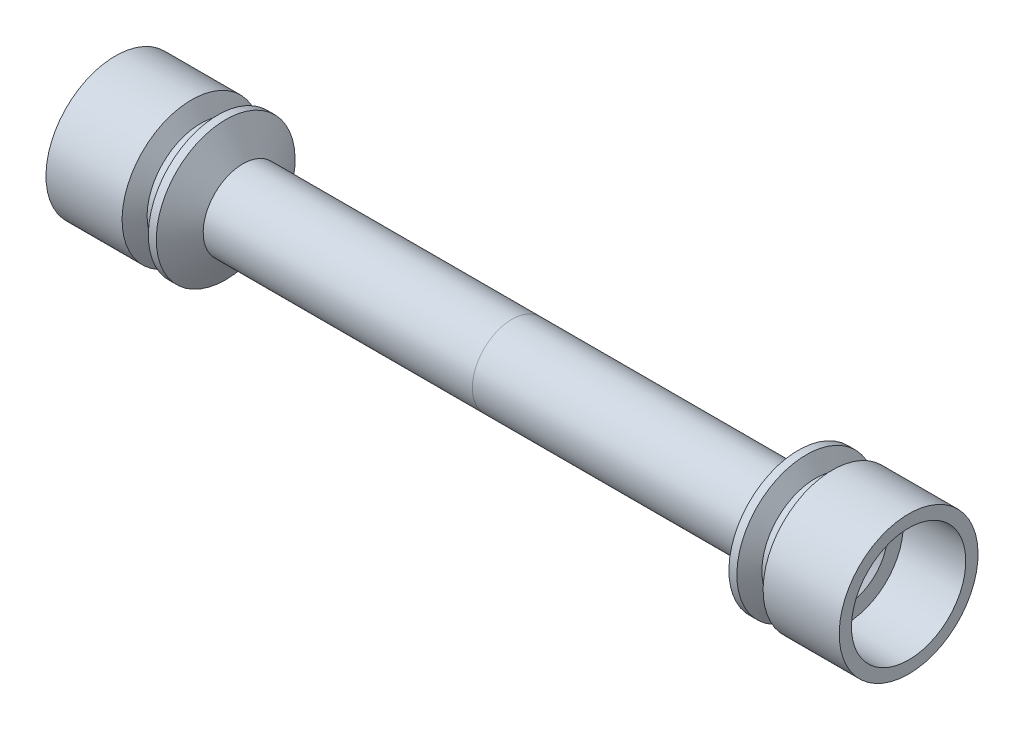
ISO-10303-21;
HEADER;
FILE_DESCRIPTION(('STEP AP214'),'2;1');
FILE_NAME('part.step','',(''),(''),'','','');
FILE_SCHEMA(('AUTOMOTIVE_DESIGN { 1 0 10303 214 1 1 1 1 }'));
ENDSEC;
DATA;
#1=APPLICATION_CONTEXT('core data for automotive mechanical design processes');
#2=APPLICATION_PROTOCOL_DEFINITION('international standard','automotive_design',2000,#1);
#3=PRODUCT_CONTEXT('',#1,'mechanical');
#4=PRODUCT('Part','Part','',(#3));
#5=PRODUCT_RELATED_PRODUCT_CATEGORY('part','',(#4));
#6=PRODUCT_DEFINITION_FORMATION('','',#4);
#7=PRODUCT_DEFINITION_CONTEXT('part definition',#1,'design');
#8=PRODUCT_DEFINITION('design','',#6,#7);
#9=PRODUCT_DEFINITION_SHAPE('','',#8);
#10=(LENGTH_UNIT() NAMED_UNIT(*) SI_UNIT(.MILLI.,.METRE.));
#11=(NAMED_UNIT(*) PLANE_ANGLE_UNIT() SI_UNIT($,.RADIAN.));
#12=(NAMED_UNIT(*) SI_UNIT($,.STERADIAN.) SOLID_ANGLE_UNIT());
#13=UNCERTAINTY_MEASURE_WITH_UNIT(LENGTH_MEASURE(1.E-05),#10,'distance_accuracy_value','');
#14=(GEOMETRIC_REPRESENTATION_CONTEXT(3) GLOBAL_UNCERTAINTY_ASSIGNED_CONTEXT((#13)) GLOBAL_UNIT_ASSIGNED_CONTEXT((#10,
#11,#12)) REPRESENTATION_CONTEXT('',''));
#15=CARTESIAN_POINT('',(0.,0.,0.));
#16=DIRECTION('',(0.,0.,1.));
#17=DIRECTION('',(1.,0.,0.));
#18=AXIS2_PLACEMENT_3D('',#15,#16,#17);
#19=CARTESIAN_POINT('',(22.9205151581292,0.,0.));
#20=DIRECTION('',(1.,0.,0.));
#21=DIRECTION('',(0.,-1.,0.));
#22=AXIS2_PLACEMENT_3D('',#19,#20,#21);
#23=CONICAL_SURFACE('',#22,5.55625,1.0471975511966);
#24=CARTESIAN_POINT('',(21.5456998296214,0.,0.));
#25=DIRECTION('',(-1.,0.,0.));
#26=DIRECTION('',(0.,-1.,0.));
#27=AXIS2_PLACEMENT_3D('',#24,#25,#26);
#28=CIRCLE('',#27,3.175);
#29=CARTESIAN_POINT('',(21.5456998296214,-3.175,0.));
#30=VERTEX_POINT('',#29);
#31=EDGE_CURVE('E177',#30,#30,#28,.T.);
#32=ORIENTED_EDGE('',*,*,#31,.F.);
#33=EDGE_LOOP('',(#32));
#34=FACE_BOUND('',#33,.T.);
#35=CARTESIAN_POINT('',(22.9205151581292,0.,0.));
#36=DIRECTION('',(-1.,0.,0.));
#37=DIRECTION('',(0.,-1.,0.));
#38=AXIS2_PLACEMENT_3D('',#35,#36,#37);
#39=CIRCLE('',#38,5.55625);
#40=CARTESIAN_POINT('',(22.9205151581292,-5.55625,0.));
#41=VERTEX_POINT('',#40);
#42=EDGE_CURVE('E12',#41,#41,#39,.T.);
#43=ORIENTED_EDGE('',*,*,#42,.T.);
#44=EDGE_LOOP('',(#43));
#45=FACE_BOUND('',#44,.T.);
#46=ADVANCED_FACE('F59',(#34,#45),#23,.T.);
#47=CARTESIAN_POINT('',(31.75,0.,0.));
#48=DIRECTION('',(1.,0.,0.));
#49=DIRECTION('',(0.,-1.,0.));
#50=AXIS2_PLACEMENT_3D('',#47,#48,#49);
#51=CYLINDRICAL_SURFACE('',#50,5.55625);
#52=ORIENTED_EDGE('',*,*,#42,.F.);
#53=EDGE_LOOP('',(#52));
#54=FACE_BOUND('',#53,.T.);
#55=CARTESIAN_POINT('',(23.5555151581292,0.,0.));
#56=DIRECTION('',(-1.,0.,0.));
#57=DIRECTION('',(0.,-1.,0.));
#58=AXIS2_PLACEMENT_3D('',#55,#56,#57);
#59=CIRCLE('',#58,5.55625);
#60=CARTESIAN_POINT('',(23.5555151581292,-5.55625,0.));
#61=VERTEX_POINT('',#60);
#62=EDGE_CURVE('E66',#61,#61,#59,.T.);
#63=ORIENTED_EDGE('',*,*,#62,.T.);
#64=EDGE_LOOP('',(#63));
#65=FACE_BOUND('',#64,.T.);
#66=ADVANCED_FACE('F131',(#54,#65),#51,.T.);
#67=CARTESIAN_POINT('',(24.28875,0.,0.));
#68=DIRECTION('',(-1.,0.,0.));
#69=DIRECTION('',(0.,1.,0.));
#70=AXIS2_PLACEMENT_3D('',#67,#68,#69);
#71=CONICAL_SURFACE('',#70,4.28625,1.0471975511966);
#72=ORIENTED_EDGE('',*,*,#62,.F.);
#73=EDGE_LOOP('',(#72));
#74=FACE_BOUND('',#73,.T.);
#75=CARTESIAN_POINT('',(24.28875,0.,0.));
#76=DIRECTION('',(-1.,0.,0.));
#77=DIRECTION('',(0.,-1.,0.));
#78=AXIS2_PLACEMENT_3D('',#75,#76,#77);
#79=CIRCLE('',#78,4.28625);
#80=CARTESIAN_POINT('',(24.28875,-4.28625,0.));
#81=VERTEX_POINT('',#80);
#82=EDGE_CURVE('E124',#81,#81,#79,.T.);
#83=ORIENTED_EDGE('',*,*,#82,.T.);
#84=EDGE_LOOP('',(#83));
#85=FACE_BOUND('',#84,.T.);
#86=ADVANCED_FACE('F133',(#74,#85),#71,.T.);
#87=CARTESIAN_POINT('',(31.75,0.,0.));
#88=DIRECTION('',(1.,0.,0.));
#89=DIRECTION('',(0.,-1.,0.));
#90=AXIS2_PLACEMENT_3D('',#87,#88,#89);
#91=CYLINDRICAL_SURFACE('',#90,4.28625);
#92=ORIENTED_EDGE('',*,*,#82,.F.);
#93=EDGE_LOOP('',(#92));
#94=FACE_BOUND('',#93,.T.);
#95=CARTESIAN_POINT('',(24.92375,0.,0.));
#96=DIRECTION('',(-1.,0.,0.));
#97=DIRECTION('',(0.,-1.,0.));
#98=AXIS2_PLACEMENT_3D('',#95,#96,#97);
#99=CIRCLE('',#98,4.28625);
#100=CARTESIAN_POINT('',(24.92375,-4.28625,0.));
#101=VERTEX_POINT('',#100);
#102=EDGE_CURVE('E120',#101,#101,#99,.T.);
#103=ORIENTED_EDGE('',*,*,#102,.T.);
#104=EDGE_LOOP('',(#103));
#105=FACE_BOUND('',#104,.T.);
#106=ADVANCED_FACE('F136',(#94,#105),#91,.T.);
#107=CARTESIAN_POINT('',(25.6569848418708,0.,0.));
#108=DIRECTION('',(1.,0.,0.));
#109=DIRECTION('',(0.,-1.,0.));
#110=AXIS2_PLACEMENT_3D('',#107,#108,#109);
#111=CONICAL_SURFACE('',#110,5.55625,1.0471975511966);
#112=ORIENTED_EDGE('',*,*,#102,.F.);
#113=EDGE_LOOP('',(#112));
#114=FACE_BOUND('',#113,.T.);
#115=CARTESIAN_POINT('',(25.6569848418708,0.,0.));
#116=DIRECTION('',(-1.,0.,0.));
#117=DIRECTION('',(0.,-1.,0.));
#118=AXIS2_PLACEMENT_3D('',#115,#116,#117);
#119=CIRCLE('',#118,5.55625);
#120=CARTESIAN_POINT('',(25.6569848418708,-5.55625,0.));
#121=VERTEX_POINT('',#120);
#122=EDGE_CURVE('E116',#121,#121,#119,.T.);
#123=ORIENTED_EDGE('',*,*,#122,.T.);
#124=EDGE_LOOP('',(#123));
#125=FACE_BOUND('',#124,.T.);
#126=ADVANCED_FACE('F142',(#114,#125),#111,.T.);
#127=CARTESIAN_POINT('',(31.75,0.,0.));
#128=DIRECTION('',(1.,0.,0.));
#129=DIRECTION('',(0.,-1.,0.));
#130=AXIS2_PLACEMENT_3D('',#127,#128,#129);
#131=CYLINDRICAL_SURFACE('',#130,5.55625);
#132=ORIENTED_EDGE('',*,*,#122,.F.);
#133=EDGE_LOOP('',(#132));
#134=FACE_BOUND('',#133,.T.);
#135=CARTESIAN_POINT('',(31.75,0.,0.));
#136=DIRECTION('',(-1.,0.,0.));
#137=DIRECTION('',(0.,-1.,0.));
#138=AXIS2_PLACEMENT_3D('',#135,#136,#137);
#139=CIRCLE('',#138,5.55625);
#140=CARTESIAN_POINT('',(31.75,-5.55625,0.));
#141=VERTEX_POINT('',#140);
#142=EDGE_CURVE('E112',#141,#141,#139,.T.);
#143=ORIENTED_EDGE('',*,*,#142,.T.);
#144=EDGE_LOOP('',(#143));
#145=FACE_BOUND('',#144,.T.);
#146=ADVANCED_FACE('F148',(#134,#145),#131,.T.);
#147=CARTESIAN_POINT('',(31.75,0.,0.));
#148=DIRECTION('',(-1.,0.,0.));
#149=DIRECTION('',(0.,1.,0.));
#150=AXIS2_PLACEMENT_3D('',#147,#148,#149);
#151=PLANE('',#150);
#152=CARTESIAN_POINT('',(31.75,0.,0.));
#153=DIRECTION('',(-1.,0.,0.));
#154=DIRECTION('',(0.,-1.,0.));
#155=AXIS2_PLACEMENT_3D('',#152,#153,#154);
#156=CIRCLE('',#155,4.575);
#157=CARTESIAN_POINT('',(31.75,-4.575,0.));
#158=VERTEX_POINT('',#157);
#159=EDGE_CURVE('E108',#158,#158,#156,.T.);
#160=ORIENTED_EDGE('',*,*,#159,.T.);
#161=EDGE_LOOP('',(#160));
#162=FACE_BOUND('',#161,.T.);
#163=ORIENTED_EDGE('',*,*,#142,.F.);
#164=EDGE_LOOP('',(#163));
#165=FACE_BOUND('',#164,.T.);
#166=ADVANCED_FACE('F154',(#162,#165),#151,.F.);
#167=CARTESIAN_POINT('',(31.75,0.,0.));
#168=DIRECTION('',(1.,0.,0.));
#169=DIRECTION('',(0.,-1.,0.));
#170=AXIS2_PLACEMENT_3D('',#167,#168,#169);
#171=CYLINDRICAL_SURFACE('',#170,4.575);
#172=CARTESIAN_POINT('',(26.75,0.,0.));
#173=DIRECTION('',(-1.,0.,0.));
#174=DIRECTION('',(0.,-1.,0.));
#175=AXIS2_PLACEMENT_3D('',#172,#173,#174);
#176=CIRCLE('',#175,4.575);
#177=CARTESIAN_POINT('',(26.75,-4.575,0.));
#178=VERTEX_POINT('',#177);
#179=EDGE_CURVE('E104',#178,#178,#176,.T.);
#180=ORIENTED_EDGE('',*,*,#179,.T.);
#181=EDGE_LOOP('',(#180));
#182=FACE_BOUND('',#181,.T.);
#183=ORIENTED_EDGE('',*,*,#159,.F.);
#184=EDGE_LOOP('',(#183));
#185=FACE_BOUND('',#184,.T.);
#186=ADVANCED_FACE('F159',(#182,#185),#171,.F.);
#187=CARTESIAN_POINT('',(26.75,0.,0.));
#188=DIRECTION('',(-1.,0.,0.));
#189=DIRECTION('',(0.,1.,0.));
#190=AXIS2_PLACEMENT_3D('',#187,#188,#189);
#191=PLANE('',#190);
#192=CARTESIAN_POINT('',(26.75,0.,0.));
#193=DIRECTION('',(-1.,0.,0.));
#194=DIRECTION('',(0.,-1.,0.));
#195=AXIS2_PLACEMENT_3D('',#192,#193,#194);
#196=CIRCLE('',#195,3.30500000000001);
#197=CARTESIAN_POINT('',(26.75,-3.30500000000001,0.));
#198=VERTEX_POINT('',#197);
#199=EDGE_CURVE('E100',#198,#198,#196,.T.);
#200=ORIENTED_EDGE('',*,*,#199,.T.);
#201=EDGE_LOOP('',(#200));
#202=FACE_BOUND('',#201,.T.);
#203=ORIENTED_EDGE('',*,*,#179,.F.);
#204=EDGE_LOOP('',(#203));
#205=FACE_BOUND('',#204,.T.);
#206=ADVANCED_FACE('F165',(#202,#205),#191,.F.);
#207=CARTESIAN_POINT('',(26.75,0.,0.));
#208=DIRECTION('',(1.,0.,0.));
#209=DIRECTION('',(0.,-1.,0.));
#210=AXIS2_PLACEMENT_3D('',#207,#208,#209);
#211=CONICAL_SURFACE('',#210,3.30500000000001,0.785398163397453);
#212=CARTESIAN_POINT('',(26.242,0.,0.));
#213=DIRECTION('',(-1.,0.,0.));
#214=DIRECTION('',(0.,-1.,0.));
#215=AXIS2_PLACEMENT_3D('',#212,#213,#214);
#216=CIRCLE('',#215,2.797);
#217=CARTESIAN_POINT('',(26.242,-2.797,0.));
#218=VERTEX_POINT('',#217);
#219=EDGE_CURVE('E96',#218,#218,#216,.T.);
#220=ORIENTED_EDGE('',*,*,#219,.T.);
#221=EDGE_LOOP('',(#220));
#222=FACE_BOUND('',#221,.T.);
#223=ORIENTED_EDGE('',*,*,#199,.F.);
#224=EDGE_LOOP('',(#223));
#225=FACE_BOUND('',#224,.T.);
#226=ADVANCED_FACE('F209',(#222,#225),#211,.F.);
#227=CARTESIAN_POINT('',(26.242,0.,0.));
#228=DIRECTION('',(-1.,0.,0.));
#229=DIRECTION('',(0.,1.,0.));
#230=AXIS2_PLACEMENT_3D('',#227,#228,#229);
#231=PLANE('',#230);
#232=CARTESIAN_POINT('',(26.242,0.,0.));
#233=DIRECTION('',(-1.,0.,0.));
#234=DIRECTION('',(0.,-1.,0.));
#235=AXIS2_PLACEMENT_3D('',#232,#233,#234);
#236=CIRCLE('',#235,1.7145);
#237=CARTESIAN_POINT('',(26.242,-1.7145,0.));
#238=VERTEX_POINT('',#237);
#239=EDGE_CURVE('E86',#238,#238,#236,.T.);
#240=ORIENTED_EDGE('',*,*,#239,.T.);
#241=EDGE_LOOP('',(#240));
#242=FACE_BOUND('',#241,.T.);
#243=ORIENTED_EDGE('',*,*,#219,.F.);
#244=EDGE_LOOP('',(#243));
#245=FACE_BOUND('',#244,.T.);
#246=ADVANCED_FACE('F205',(#242,#245),#231,.F.);
#247=CARTESIAN_POINT('',(31.75,0.,0.));
#248=DIRECTION('',(1.,0.,0.));
#249=DIRECTION('',(0.,-1.,0.));
#250=AXIS2_PLACEMENT_3D('',#247,#248,#249);
#251=CYLINDRICAL_SURFACE('',#250,1.7145);
#252=CARTESIAN_POINT('',(21.925,0.,0.));
#253=DIRECTION('',(-1.,0.,0.));
#254=DIRECTION('',(0.,-1.,0.));
#255=AXIS2_PLACEMENT_3D('',#252,#253,#254);
#256=CIRCLE('',#255,1.7145);
#257=CARTESIAN_POINT('',(21.925,-1.7145,0.));
#258=VERTEX_POINT('',#257);
#259=EDGE_CURVE('E80',#258,#258,#256,.T.);
#260=ORIENTED_EDGE('',*,*,#259,.T.);
#261=EDGE_LOOP('',(#260));
#262=FACE_BOUND('',#261,.T.);
#263=ORIENTED_EDGE('',*,*,#239,.F.);
#264=EDGE_LOOP('',(#263));
#265=FACE_BOUND('',#264,.T.);
#266=ADVANCED_FACE('F201',(#262,#265),#251,.F.);
#267=CARTESIAN_POINT('',(21.925,0.,0.));
#268=DIRECTION('',(-1.,0.,0.));
#269=DIRECTION('',(0.,1.,0.));
#270=AXIS2_PLACEMENT_3D('',#267,#268,#269);
#271=PLANE('',#270);
#272=ORIENTED_EDGE('',*,*,#259,.F.);
#273=EDGE_LOOP('',(#272));
#274=FACE_BOUND('',#273,.T.);
#275=ADVANCED_FACE('F73',(#274),#271,.F.);
#276=CARTESIAN_POINT('',(12.5,0.,0.));
#277=DIRECTION('',(-1.,0.,0.));
#278=DIRECTION('',(0.,1.,0.));
#279=AXIS2_PLACEMENT_3D('',#276,#277,#278);
#280=CONICAL_SURFACE('',#279,1.6,0.78539816339745);
#281=CARTESIAN_POINT('',(14.1,0.,0.));
#282=VERTEX_POINT('',#281);
#283=VERTEX_LOOP('',#282);
#284=FACE_BOUND('',#283,.T.);
#285=CARTESIAN_POINT('',(12.5,0.,0.));
#286=DIRECTION('',(-1.,0.,0.));
#287=DIRECTION('',(0.,-1.,0.));
#288=AXIS2_PLACEMENT_3D('',#285,#286,#287);
#289=CIRCLE('',#288,1.6);
#290=CARTESIAN_POINT('',(12.5,-1.6,0.));
#291=VERTEX_POINT('',#290);
#292=EDGE_CURVE('E77',#291,#291,#289,.T.);
#293=ORIENTED_EDGE('',*,*,#292,.T.);
#294=EDGE_LOOP('',(#293));
#295=FACE_BOUND('',#294,.T.);
#296=ADVANCED_FACE('F69',(#284,#295),#280,.F.);
#297=CARTESIAN_POINT('',(31.75,0.,0.));
#298=DIRECTION('',(1.,0.,0.));
#299=DIRECTION('',(0.,-1.,0.));
#300=AXIS2_PLACEMENT_3D('',#297,#298,#299);
#301=CYLINDRICAL_SURFACE('',#300,1.6);
#302=ORIENTED_EDGE('',*,*,#292,.F.);
#303=EDGE_LOOP('',(#302));
#304=FACE_BOUND('',#303,.T.);
#305=CARTESIAN_POINT('',(0.,0.,0.));
#306=DIRECTION('',(-1.,0.,0.));
#307=DIRECTION('',(0.,-1.,0.));
#308=AXIS2_PLACEMENT_3D('',#305,#306,#307);
#309=CIRCLE('',#308,1.6);
#310=CARTESIAN_POINT('',(0.,-1.6,0.));
#311=VERTEX_POINT('',#310);
#312=EDGE_CURVE('E81',#311,#311,#309,.T.);
#313=ORIENTED_EDGE('',*,*,#312,.T.);
#314=EDGE_LOOP('',(#313));
#315=FACE_BOUND('',#314,.T.);
#316=ADVANCED_FACE('F72',(#304,#315),#301,.F.);
#317=CARTESIAN_POINT('',(0.,0.,0.));
#318=DIRECTION('',(1.,0.,0.));
#319=DIRECTION('',(0.,-1.,0.));
#320=AXIS2_PLACEMENT_3D('',#317,#318,#319);
#321=PLANE('',#320);
#322=CARTESIAN_POINT('',(0.,0.,0.));
#323=DIRECTION('',(-1.,0.,0.));
#324=DIRECTION('',(0.,-1.,0.));
#325=AXIS2_PLACEMENT_3D('',#322,#323,#324);
#326=CIRCLE('',#325,3.175);
#327=CARTESIAN_POINT('',(0.,-3.175,0.));
#328=VERTEX_POINT('',#327);
#329=EDGE_CURVE('E89',#328,#328,#326,.T.);
#330=ORIENTED_EDGE('',*,*,#329,.T.);
#331=EDGE_LOOP('',(#330));
#332=FACE_BOUND('',#331,.T.);
#333=ORIENTED_EDGE('',*,*,#312,.F.);
#334=EDGE_LOOP('',(#333));
#335=FACE_BOUND('',#334,.T.);
#336=ADVANCED_FACE('F186',(#332,#335),#321,.F.);
#337=CARTESIAN_POINT('',(31.75,0.,0.));
#338=DIRECTION('',(1.,0.,0.));
#339=DIRECTION('',(0.,-1.,0.));
#340=AXIS2_PLACEMENT_3D('',#337,#338,#339);
#341=CYLINDRICAL_SURFACE('',#340,3.175);
#342=ORIENTED_EDGE('',*,*,#329,.F.);
#343=EDGE_LOOP('',(#342));
#344=FACE_BOUND('',#343,.T.);
#345=ORIENTED_EDGE('',*,*,#31,.T.);
#346=EDGE_LOOP('',(#345));
#347=FACE_BOUND('',#346,.T.);
#348=ADVANCED_FACE('F189',(#344,#347),#341,.T.);
#349=CLOSED_SHELL('',(#46,#66,#86,#106,#126,#146,#166,#186,#206,#226,#246,#266,#275,#296,#316,
#336,#348));
#350=MANIFOLD_SOLID_BREP('B2',#349);
#351=CARTESIAN_POINT('',(-22.9205151581292,0.,0.));
#352=DIRECTION('',(-1.,0.,0.));
#353=DIRECTION('',(0.,-1.,0.));
#354=AXIS2_PLACEMENT_3D('',#351,#352,#353);
#355=CONICAL_SURFACE('',#354,5.55625,1.0471975511966);
#356=CARTESIAN_POINT('',(-21.5456998296214,0.,0.));
#357=DIRECTION('',(-1.,0.,0.));
#358=DIRECTION('',(0.,-1.,0.));
#359=AXIS2_PLACEMENT_3D('',#356,#357,#358);
#360=CIRCLE('',#359,3.175);
#361=CARTESIAN_POINT('',(-21.5456998296214,-3.175,0.));
#362=VERTEX_POINT('',#361);
#363=EDGE_CURVE('E467',#362,#362,#360,.T.);
#364=ORIENTED_EDGE('',*,*,#363,.T.);
#365=EDGE_LOOP('',(#364));
#366=FACE_BOUND('',#365,.T.);
#367=CARTESIAN_POINT('',(-22.9205151581292,0.,0.));
#368=DIRECTION('',(-1.,0.,0.));
#369=DIRECTION('',(0.,-1.,0.));
#370=AXIS2_PLACEMENT_3D('',#367,#368,#369);
#371=CIRCLE('',#370,5.55625);
#372=CARTESIAN_POINT('',(-22.9205151581292,-5.55625,0.));
#373=VERTEX_POINT('',#372);
#374=EDGE_CURVE('E386',#373,#373,#371,.T.);
#375=ORIENTED_EDGE('',*,*,#374,.F.);
#376=EDGE_LOOP('',(#375));
#377=FACE_BOUND('',#376,.T.);
#378=ADVANCED_FACE('F328',(#366,#377),#355,.T.);
#379=CARTESIAN_POINT('',(-31.75,0.,0.));
#380=DIRECTION('',(-1.,0.,0.));
#381=DIRECTION('',(0.,-1.,0.));
#382=AXIS2_PLACEMENT_3D('',#379,#380,#381);
#383=CYLINDRICAL_SURFACE('',#382,5.55625);
#384=ORIENTED_EDGE('',*,*,#374,.T.);
#385=EDGE_LOOP('',(#384));
#386=FACE_BOUND('',#385,.T.);
#387=CARTESIAN_POINT('',(-23.5555151581292,0.,0.));
#388=DIRECTION('',(-1.,0.,0.));
#389=DIRECTION('',(0.,-1.,0.));
#390=AXIS2_PLACEMENT_3D('',#387,#388,#389);
#391=CIRCLE('',#390,5.55625);
#392=CARTESIAN_POINT('',(-23.5555151581292,-5.55625,0.));
#393=VERTEX_POINT('',#392);
#394=EDGE_CURVE('E383',#393,#393,#391,.T.);
#395=ORIENTED_EDGE('',*,*,#394,.F.);
#396=EDGE_LOOP('',(#395));
#397=FACE_BOUND('',#396,.T.);
#398=ADVANCED_FACE('F406',(#386,#397),#383,.T.);
#399=CARTESIAN_POINT('',(-24.28875,0.,0.));
#400=DIRECTION('',(1.,0.,0.));
#401=DIRECTION('',(0.,1.,0.));
#402=AXIS2_PLACEMENT_3D('',#399,#400,#401);
#403=CONICAL_SURFACE('',#402,4.28625,1.0471975511966);
#404=ORIENTED_EDGE('',*,*,#394,.T.);
#405=EDGE_LOOP('',(#404));
#406=FACE_BOUND('',#405,.T.);
#407=CARTESIAN_POINT('',(-24.28875,0.,0.));
#408=DIRECTION('',(-1.,0.,0.));
#409=DIRECTION('',(0.,-1.,0.));
#410=AXIS2_PLACEMENT_3D('',#407,#408,#409);
#411=CIRCLE('',#410,4.28625);
#412=CARTESIAN_POINT('',(-24.28875,-4.28625,0.));
#413=VERTEX_POINT('',#412);
#414=EDGE_CURVE('E380',#413,#413,#411,.T.);
#415=ORIENTED_EDGE('',*,*,#414,.F.);
#416=EDGE_LOOP('',(#415));
#417=FACE_BOUND('',#416,.T.);
#418=ADVANCED_FACE('F411',(#406,#417),#403,.T.);
#419=CARTESIAN_POINT('',(-31.75,0.,0.));
#420=DIRECTION('',(-1.,0.,0.));
#421=DIRECTION('',(0.,-1.,0.));
#422=AXIS2_PLACEMENT_3D('',#419,#420,#421);
#423=CYLINDRICAL_SURFACE('',#422,4.28625);
#424=ORIENTED_EDGE('',*,*,#414,.T.);
#425=EDGE_LOOP('',(#424));
#426=FACE_BOUND('',#425,.T.);
#427=CARTESIAN_POINT('',(-24.92375,0.,0.));
#428=DIRECTION('',(-1.,0.,0.));
#429=DIRECTION('',(0.,-1.,0.));
#430=AXIS2_PLACEMENT_3D('',#427,#428,#429);
#431=CIRCLE('',#430,4.28625);
#432=CARTESIAN_POINT('',(-24.92375,-4.28625,0.));
#433=VERTEX_POINT('',#432);
#434=EDGE_CURVE('E377',#433,#433,#431,.T.);
#435=ORIENTED_EDGE('',*,*,#434,.F.);
#436=EDGE_LOOP('',(#435));
#437=FACE_BOUND('',#436,.T.);
#438=ADVANCED_FACE('F419',(#426,#437),#423,.T.);
#439=CARTESIAN_POINT('',(-25.6569848418708,0.,0.));
#440=DIRECTION('',(-1.,0.,0.));
#441=DIRECTION('',(0.,-1.,0.));
#442=AXIS2_PLACEMENT_3D('',#439,#440,#441);
#443=CONICAL_SURFACE('',#442,5.55625,1.0471975511966);
#444=ORIENTED_EDGE('',*,*,#434,.T.);
#445=EDGE_LOOP('',(#444));
#446=FACE_BOUND('',#445,.T.);
#447=CARTESIAN_POINT('',(-25.6569848418708,0.,0.));
#448=DIRECTION('',(-1.,0.,0.));
#449=DIRECTION('',(0.,-1.,0.));
#450=AXIS2_PLACEMENT_3D('',#447,#448,#449);
#451=CIRCLE('',#450,5.55625);
#452=CARTESIAN_POINT('',(-25.6569848418708,-5.55625,0.));
#453=VERTEX_POINT('',#452);
#454=EDGE_CURVE('E374',#453,#453,#451,.T.);
#455=ORIENTED_EDGE('',*,*,#454,.F.);
#456=EDGE_LOOP('',(#455));
#457=FACE_BOUND('',#456,.T.);
#458=ADVANCED_FACE('F423',(#446,#457),#443,.T.);
#459=CARTESIAN_POINT('',(-31.75,0.,0.));
#460=DIRECTION('',(-1.,0.,0.));
#461=DIRECTION('',(0.,-1.,0.));
#462=AXIS2_PLACEMENT_3D('',#459,#460,#461);
#463=CYLINDRICAL_SURFACE('',#462,5.55625);
#464=ORIENTED_EDGE('',*,*,#454,.T.);
#465=EDGE_LOOP('',(#464));
#466=FACE_BOUND('',#465,.T.);
#467=CARTESIAN_POINT('',(-31.75,0.,0.));
#468=DIRECTION('',(-1.,0.,0.));
#469=DIRECTION('',(0.,-1.,0.));
#470=AXIS2_PLACEMENT_3D('',#467,#468,#469);
#471=CIRCLE('',#470,5.55625);
#472=CARTESIAN_POINT('',(-31.75,-5.55625,0.));
#473=VERTEX_POINT('',#472);
#474=EDGE_CURVE('E371',#473,#473,#471,.T.);
#475=ORIENTED_EDGE('',*,*,#474,.F.);
#476=EDGE_LOOP('',(#475));
#477=FACE_BOUND('',#476,.T.);
#478=ADVANCED_FACE('F427',(#466,#477),#463,.T.);
#479=CARTESIAN_POINT('',(-31.75,0.,0.));
#480=DIRECTION('',(1.,0.,0.));
#481=DIRECTION('',(0.,1.,0.));
#482=AXIS2_PLACEMENT_3D('',#479,#480,#481);
#483=PLANE('',#482);
#484=CARTESIAN_POINT('',(-31.75,0.,0.));
#485=DIRECTION('',(1.,0.,0.));
#486=DIRECTION('',(0.,1.,0.));
#487=AXIS2_PLACEMENT_3D('',#484,#485,#486);
#488=CIRCLE('',#487,5.083);
#489=CARTESIAN_POINT('',(-31.75,5.083,0.));
#490=VERTEX_POINT('',#489);
#491=EDGE_CURVE('E57',#490,#490,#488,.T.);
#492=ORIENTED_EDGE('',*,*,#491,.T.);
#493=EDGE_LOOP('',(#492));
#494=FACE_BOUND('',#493,.T.);
#495=ORIENTED_EDGE('',*,*,#474,.T.);
#496=EDGE_LOOP('',(#495));
#497=FACE_BOUND('',#496,.T.);
#498=ADVANCED_FACE('F431',(#494,#497),#483,.F.);
#499=CARTESIAN_POINT('',(-31.75,0.,0.));
#500=DIRECTION('',(-1.,0.,0.));
#501=DIRECTION('',(0.,-1.,0.));
#502=AXIS2_PLACEMENT_3D('',#499,#500,#501);
#503=CYLINDRICAL_SURFACE('',#502,4.575);
#504=CARTESIAN_POINT('',(-31.242,0.,0.));
#505=DIRECTION('',(1.,0.,0.));
#506=DIRECTION('',(0.,1.,0.));
#507=AXIS2_PLACEMENT_3D('',#504,#505,#506);
#508=CIRCLE('',#507,4.575);
#509=CARTESIAN_POINT('',(-31.242,4.575,0.));
#510=VERTEX_POINT('',#509);
#511=EDGE_CURVE('E336',#510,#510,#508,.F.);
#512=ORIENTED_EDGE('',*,*,#511,.T.);
#513=EDGE_LOOP('',(#512));
#514=FACE_BOUND('',#513,.T.);
#515=CARTESIAN_POINT('',(-26.75,0.,0.));
#516=DIRECTION('',(-1.,0.,0.));
#517=DIRECTION('',(0.,-1.,0.));
#518=AXIS2_PLACEMENT_3D('',#515,#516,#517);
#519=CIRCLE('',#518,4.575);
#520=CARTESIAN_POINT('',(-26.75,-4.575,0.));
#521=VERTEX_POINT('',#520);
#522=EDGE_CURVE('E368',#521,#521,#519,.T.);
#523=ORIENTED_EDGE('',*,*,#522,.F.);
#524=EDGE_LOOP('',(#523));
#525=FACE_BOUND('',#524,.T.);
#526=ADVANCED_FACE('F391',(#514,#525),#503,.F.);
#527=CARTESIAN_POINT('',(-26.75,0.,0.));
#528=DIRECTION('',(1.,0.,0.));
#529=DIRECTION('',(0.,1.,0.));
#530=AXIS2_PLACEMENT_3D('',#527,#528,#529);
#531=PLANE('',#530);
#532=CARTESIAN_POINT('',(-26.75,0.,0.));
#533=DIRECTION('',(-1.,0.,0.));
#534=DIRECTION('',(0.,-1.,0.));
#535=AXIS2_PLACEMENT_3D('',#532,#533,#534);
#536=CIRCLE('',#535,3.30500000000001);
#537=CARTESIAN_POINT('',(-26.75,-3.30500000000001,0.));
#538=VERTEX_POINT('',#537);
#539=EDGE_CURVE('E365',#538,#538,#536,.T.);
#540=ORIENTED_EDGE('',*,*,#539,.F.);
#541=EDGE_LOOP('',(#540));
#542=FACE_BOUND('',#541,.T.);
#543=ORIENTED_EDGE('',*,*,#522,.T.);
#544=EDGE_LOOP('',(#543));
#545=FACE_BOUND('',#544,.T.);
#546=ADVANCED_FACE('F437',(#542,#545),#531,.F.);
#547=CARTESIAN_POINT('',(-26.75,0.,0.));
#548=DIRECTION('',(-1.,0.,0.));
#549=DIRECTION('',(0.,-1.,0.));
#550=AXIS2_PLACEMENT_3D('',#547,#548,#549);
#551=CONICAL_SURFACE('',#550,3.30500000000001,0.785398163397453);
#552=CARTESIAN_POINT('',(-26.242,0.,0.));
#553=DIRECTION('',(-1.,0.,0.));
#554=DIRECTION('',(0.,-1.,0.));
#555=AXIS2_PLACEMENT_3D('',#552,#553,#554);
#556=CIRCLE('',#555,2.797);
#557=CARTESIAN_POINT('',(-26.242,-2.797,0.));
#558=VERTEX_POINT('',#557);
#559=EDGE_CURVE('E362',#558,#558,#556,.T.);
#560=ORIENTED_EDGE('',*,*,#559,.F.);
#561=EDGE_LOOP('',(#560));
#562=FACE_BOUND('',#561,.T.);
#563=ORIENTED_EDGE('',*,*,#539,.T.);
#564=EDGE_LOOP('',(#563));
#565=FACE_BOUND('',#564,.T.);
#566=ADVANCED_FACE('F440',(#562,#565),#551,.F.);
#567=CARTESIAN_POINT('',(-26.242,0.,0.));
#568=DIRECTION('',(1.,0.,0.));
#569=DIRECTION('',(0.,1.,0.));
#570=AXIS2_PLACEMENT_3D('',#567,#568,#569);
#571=PLANE('',#570);
#572=CARTESIAN_POINT('',(-26.242,0.,0.));
#573=DIRECTION('',(-1.,0.,0.));
#574=DIRECTION('',(0.,-1.,0.));
#575=AXIS2_PLACEMENT_3D('',#572,#573,#574);
#576=CIRCLE('',#575,1.7145);
#577=CARTESIAN_POINT('',(-26.242,-1.7145,0.));
#578=VERTEX_POINT('',#577);
#579=EDGE_CURVE('E353',#578,#578,#576,.T.);
#580=ORIENTED_EDGE('',*,*,#579,.F.);
#581=EDGE_LOOP('',(#580));
#582=FACE_BOUND('',#581,.T.);
#583=ORIENTED_EDGE('',*,*,#559,.T.);
#584=EDGE_LOOP('',(#583));
#585=FACE_BOUND('',#584,.T.);
#586=ADVANCED_FACE('F444',(#582,#585),#571,.F.);
#587=CARTESIAN_POINT('',(-31.75,0.,0.));
#588=DIRECTION('',(-1.,0.,0.));
#589=DIRECTION('',(0.,-1.,0.));
#590=AXIS2_PLACEMENT_3D('',#587,#588,#589);
#591=CYLINDRICAL_SURFACE('',#590,1.7145);
#592=CARTESIAN_POINT('',(-21.925,0.,0.));
#593=DIRECTION('',(-1.,0.,0.));
#594=DIRECTION('',(0.,-1.,0.));
#595=AXIS2_PLACEMENT_3D('',#592,#593,#594);
#596=CIRCLE('',#595,1.7145);
#597=CARTESIAN_POINT('',(-21.925,-1.7145,0.));
#598=VERTEX_POINT('',#597);
#599=EDGE_CURVE('E349',#598,#598,#596,.T.);
#600=ORIENTED_EDGE('',*,*,#599,.F.);
#601=EDGE_LOOP('',(#600));
#602=FACE_BOUND('',#601,.T.);
#603=ORIENTED_EDGE('',*,*,#579,.T.);
#604=EDGE_LOOP('',(#603));
#605=FACE_BOUND('',#604,.T.);
#606=ADVANCED_FACE('F448',(#602,#605),#591,.F.);
#607=CARTESIAN_POINT('',(-21.925,0.,0.));
#608=DIRECTION('',(1.,0.,0.));
#609=DIRECTION('',(0.,1.,0.));
#610=AXIS2_PLACEMENT_3D('',#607,#608,#609);
#611=PLANE('',#610);
#612=ORIENTED_EDGE('',*,*,#599,.T.);
#613=EDGE_LOOP('',(#612));
#614=FACE_BOUND('',#613,.T.);
#615=ADVANCED_FACE('F343',(#614),#611,.F.);
#616=CARTESIAN_POINT('',(-12.5,0.,0.));
#617=DIRECTION('',(1.,0.,0.));
#618=DIRECTION('',(0.,1.,0.));
#619=AXIS2_PLACEMENT_3D('',#616,#617,#618);
#620=CONICAL_SURFACE('',#619,1.6,0.78539816339745);
#621=CARTESIAN_POINT('',(-14.1,0.,0.));
#622=VERTEX_POINT('',#621);
#623=VERTEX_LOOP('',#622);
#624=FACE_BOUND('',#623,.T.);
#625=CARTESIAN_POINT('',(-12.5,0.,0.));
#626=DIRECTION('',(-1.,0.,0.));
#627=DIRECTION('',(0.,-1.,0.));
#628=AXIS2_PLACEMENT_3D('',#625,#626,#627);
#629=CIRCLE('',#628,1.6);
#630=CARTESIAN_POINT('',(-12.5,-1.6,0.));
#631=VERTEX_POINT('',#630);
#632=EDGE_CURVE('E347',#631,#631,#629,.T.);
#633=ORIENTED_EDGE('',*,*,#632,.F.);
#634=EDGE_LOOP('',(#633));
#635=FACE_BOUND('',#634,.T.);
#636=ADVANCED_FACE('F339',(#624,#635),#620,.F.);
#637=CARTESIAN_POINT('',(-31.75,0.,0.));
#638=DIRECTION('',(-1.,0.,0.));
#639=DIRECTION('',(0.,-1.,0.));
#640=AXIS2_PLACEMENT_3D('',#637,#638,#639);
#641=CYLINDRICAL_SURFACE('',#640,1.6);
#642=ORIENTED_EDGE('',*,*,#632,.T.);
#643=EDGE_LOOP('',(#642));
#644=FACE_BOUND('',#643,.T.);
#645=CARTESIAN_POINT('',(0.,0.,0.));
#646=DIRECTION('',(-1.,0.,0.));
#647=DIRECTION('',(0.,-1.,0.));
#648=AXIS2_PLACEMENT_3D('',#645,#646,#647);
#649=CIRCLE('',#648,1.6);
#650=CARTESIAN_POINT('',(0.,-1.6,0.));
#651=VERTEX_POINT('',#650);
#652=EDGE_CURVE('E350',#651,#651,#649,.T.);
#653=ORIENTED_EDGE('',*,*,#652,.F.);
#654=EDGE_LOOP('',(#653));
#655=FACE_BOUND('',#654,.T.);
#656=ADVANCED_FACE('F342',(#644,#655),#641,.F.);
#657=CARTESIAN_POINT('',(0.,0.,0.));
#658=DIRECTION('',(-1.,0.,0.));
#659=DIRECTION('',(0.,-1.,0.));
#660=AXIS2_PLACEMENT_3D('',#657,#658,#659);
#661=PLANE('',#660);
#662=CARTESIAN_POINT('',(0.,0.,0.));
#663=DIRECTION('',(-1.,0.,0.));
#664=DIRECTION('',(0.,-1.,0.));
#665=AXIS2_PLACEMENT_3D('',#662,#663,#664);
#666=CIRCLE('',#665,3.175);
#667=CARTESIAN_POINT('',(0.,-3.175,0.));
#668=VERTEX_POINT('',#667);
#669=EDGE_CURVE('E356',#668,#668,#666,.T.);
#670=ORIENTED_EDGE('',*,*,#669,.F.);
#671=EDGE_LOOP('',(#670));
#672=FACE_BOUND('',#671,.T.);
#673=ORIENTED_EDGE('',*,*,#652,.T.);
#674=EDGE_LOOP('',(#673));
#675=FACE_BOUND('',#674,.T.);
#676=ADVANCED_FACE('F401',(#672,#675),#661,.F.);
#677=CARTESIAN_POINT('',(-31.75,0.,0.));
#678=DIRECTION('',(-1.,0.,0.));
#679=DIRECTION('',(0.,-1.,0.));
#680=AXIS2_PLACEMENT_3D('',#677,#678,#679);
#681=CYLINDRICAL_SURFACE('',#680,3.175);
#682=ORIENTED_EDGE('',*,*,#669,.T.);
#683=EDGE_LOOP('',(#682));
#684=FACE_BOUND('',#683,.T.);
#685=ORIENTED_EDGE('',*,*,#363,.F.);
#686=EDGE_LOOP('',(#685));
#687=FACE_BOUND('',#686,.T.);
#688=ADVANCED_FACE('F395',(#684,#687),#681,.T.);
#689=CARTESIAN_POINT('',(-31.242,0.,0.));
#690=DIRECTION('',(-1.,0.,0.));
#691=DIRECTION('',(0.,-1.,0.));
#692=AXIS2_PLACEMENT_3D('',#689,#690,#691);
#693=CONICAL_SURFACE('',#692,4.575,0.785398163397447);
#694=ORIENTED_EDGE('',*,*,#491,.F.);
#695=EDGE_LOOP('',(#694));
#696=FACE_BOUND('',#695,.T.);
#697=ORIENTED_EDGE('',*,*,#511,.F.);
#698=EDGE_LOOP('',(#697));
#699=FACE_BOUND('',#698,.T.);
#700=ADVANCED_FACE('F331',(#696,#699),#693,.F.);
#701=CLOSED_SHELL('',(#378,#398,#418,#438,#458,#478,#498,#526,#546,#566,#586,#606,#615,#636,
#656,#676,#688,#700));
#702=MANIFOLD_SOLID_BREP('B6',#701);
#703=ADVANCED_BREP_SHAPE_REPRESENTATION('',(#18,#350,#702),#14);
#704=SHAPE_DEFINITION_REPRESENTATION(#9,#703);
ENDSEC;
END-ISO-10303-21;
